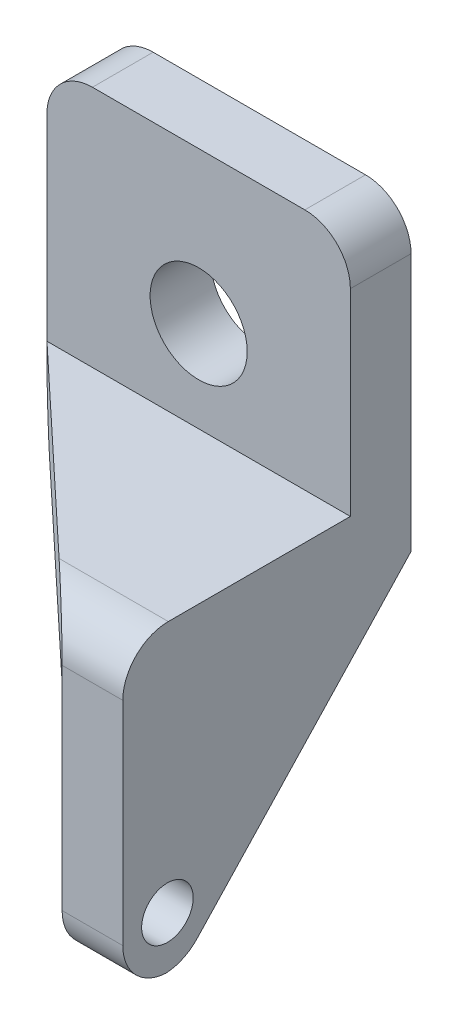
ISO-10303-21;
HEADER;
FILE_DESCRIPTION(('STEP AP214'),'2;1');
FILE_NAME('part.step','',(''),(''),'','','');
FILE_SCHEMA(('AUTOMOTIVE_DESIGN { 1 0 10303 214 1 1 1 1 }'));
ENDSEC;
DATA;
#1=APPLICATION_CONTEXT('core data for automotive mechanical design processes');
#2=APPLICATION_PROTOCOL_DEFINITION('international standard','automotive_design',2000,#1);
#3=PRODUCT_CONTEXT('',#1,'mechanical');
#4=PRODUCT('Part','Part','',(#3));
#5=PRODUCT_RELATED_PRODUCT_CATEGORY('part','',(#4));
#6=PRODUCT_DEFINITION_FORMATION('','',#4);
#7=PRODUCT_DEFINITION_CONTEXT('part definition',#1,'design');
#8=PRODUCT_DEFINITION('design','',#6,#7);
#9=PRODUCT_DEFINITION_SHAPE('','',#8);
#10=(LENGTH_UNIT() NAMED_UNIT(*) SI_UNIT(.MILLI.,.METRE.));
#11=(NAMED_UNIT(*) PLANE_ANGLE_UNIT() SI_UNIT($,.RADIAN.));
#12=(NAMED_UNIT(*) SI_UNIT($,.STERADIAN.) SOLID_ANGLE_UNIT());
#13=UNCERTAINTY_MEASURE_WITH_UNIT(LENGTH_MEASURE(1.E-05),#10,'distance_accuracy_value','');
#14=(GEOMETRIC_REPRESENTATION_CONTEXT(3) GLOBAL_UNCERTAINTY_ASSIGNED_CONTEXT((#13)) GLOBAL_UNIT_ASSIGNED_CONTEXT((#10,
#11,#12)) REPRESENTATION_CONTEXT('',''));
#15=CARTESIAN_POINT('',(0.,0.,0.));
#16=DIRECTION('',(0.,0.,1.));
#17=DIRECTION('',(1.,0.,0.));
#18=AXIS2_PLACEMENT_3D('',#15,#16,#17);
#19=CARTESIAN_POINT('',(0.,0.,4.));
#20=DIRECTION('',(0.,0.,-1.));
#21=DIRECTION('',(-1.,0.,0.));
#22=AXIS2_PLACEMENT_3D('',#19,#20,#21);
#23=PLANE('',#22);
#24=CARTESIAN_POINT('',(0.,0.,4.));
#25=DIRECTION('',(0.,0.,1.));
#26=DIRECTION('',(1.,0.,0.));
#27=AXIS2_PLACEMENT_3D('',#24,#25,#26);
#28=CIRCLE('',#27,3.2);
#29=CARTESIAN_POINT('',(3.2,0.,4.));
#30=VERTEX_POINT('',#29);
#31=EDGE_CURVE('E189',#30,#30,#28,.T.);
#32=ORIENTED_EDGE('',*,*,#31,.F.);
#33=EDGE_LOOP('',(#32));
#34=FACE_BOUND('',#33,.T.);
#35=DIRECTION('',(-1.,0.,0.));
#36=VECTOR('',#35,1.);
#37=CARTESIAN_POINT('',(-9.99999999999999,10.,4.));
#38=LINE('',#37,#36);
#39=CARTESIAN_POINT('',(7.,10.,4.));
#40=VERTEX_POINT('',#39);
#41=CARTESIAN_POINT('',(-7.,10.,4.));
#42=VERTEX_POINT('',#41);
#43=EDGE_CURVE('E195',#40,#42,#38,.T.);
#44=ORIENTED_EDGE('',*,*,#43,.T.);
#45=CARTESIAN_POINT('',(-7.,7.,4.));
#46=DIRECTION('',(0.,0.,-1.));
#47=DIRECTION('',(-1.,0.,0.));
#48=AXIS2_PLACEMENT_3D('',#45,#46,#47);
#49=CIRCLE('',#48,3.);
#50=CARTESIAN_POINT('',(-9.99999999999999,7.,4.));
#51=VERTEX_POINT('',#50);
#52=EDGE_CURVE('E11',#42,#51,#49,.F.);
#53=ORIENTED_EDGE('',*,*,#52,.T.);
#54=DIRECTION('',(0.,-1.,0.));
#55=VECTOR('',#54,1.);
#56=CARTESIAN_POINT('',(-10.,-10.,4.));
#57=LINE('',#56,#55);
#58=CARTESIAN_POINT('',(-10.,-6.,4.));
#59=VERTEX_POINT('',#58);
#60=EDGE_CURVE('E197',#51,#59,#57,.T.);
#61=ORIENTED_EDGE('',*,*,#60,.T.);
#62=DIRECTION('',(-1.,0.,0.));
#63=VECTOR('',#62,1.);
#64=CARTESIAN_POINT('',(-10.,-6.,4.));
#65=LINE('',#64,#63);
#66=CARTESIAN_POINT('',(10.,-6.,4.));
#67=VERTEX_POINT('',#66);
#68=EDGE_CURVE('E180',#67,#59,#65,.T.);
#69=ORIENTED_EDGE('',*,*,#68,.F.);
#70=DIRECTION('',(0.,1.,0.));
#71=VECTOR('',#70,1.);
#72=CARTESIAN_POINT('',(10.,-10.,4.));
#73=LINE('',#72,#71);
#74=CARTESIAN_POINT('',(10.,7.,4.));
#75=VERTEX_POINT('',#74);
#76=EDGE_CURVE('E143',#67,#75,#73,.T.);
#77=ORIENTED_EDGE('',*,*,#76,.T.);
#78=CARTESIAN_POINT('',(7.,7.,4.));
#79=DIRECTION('',(0.,0.,-1.));
#80=DIRECTION('',(-1.,0.,0.));
#81=AXIS2_PLACEMENT_3D('',#78,#79,#80);
#82=CIRCLE('',#81,3.);
#83=EDGE_CURVE('E41',#75,#40,#82,.F.);
#84=ORIENTED_EDGE('',*,*,#83,.T.);
#85=EDGE_LOOP('',(#44,#53,#61,#69,#77,#84));
#86=FACE_BOUND('',#85,.T.);
#87=ADVANCED_FACE('F33',(#34,#86),#23,.F.);
#88=CARTESIAN_POINT('',(0.,0.,0.));
#89=DIRECTION('',(0.,0.,-1.));
#90=DIRECTION('',(-1.,0.,0.));
#91=AXIS2_PLACEMENT_3D('',#88,#89,#90);
#92=PLANE('',#91);
#93=DIRECTION('',(1.,0.,0.));
#94=VECTOR('',#93,1.);
#95=CARTESIAN_POINT('',(-10.,-10.,0.));
#96=LINE('',#95,#94);
#97=CARTESIAN_POINT('',(-7.,-10.,0.));
#98=VERTEX_POINT('',#97);
#99=CARTESIAN_POINT('',(6.,-10.,0.));
#100=VERTEX_POINT('',#99);
#101=EDGE_CURVE('E132',#98,#100,#96,.T.);
#102=ORIENTED_EDGE('',*,*,#101,.F.);
#103=CARTESIAN_POINT('',(-7.,-7.,0.));
#104=DIRECTION('',(0.,0.,-1.));
#105=DIRECTION('',(-1.,0.,0.));
#106=AXIS2_PLACEMENT_3D('',#103,#104,#105);
#107=CIRCLE('',#106,3.);
#108=CARTESIAN_POINT('',(-10.,-7.,0.));
#109=VERTEX_POINT('',#108);
#110=EDGE_CURVE('E239',#98,#109,#107,.T.);
#111=ORIENTED_EDGE('',*,*,#110,.T.);
#112=DIRECTION('',(0.,-1.,0.));
#113=VECTOR('',#112,1.);
#114=CARTESIAN_POINT('',(-10.,-10.,0.));
#115=LINE('',#114,#113);
#116=CARTESIAN_POINT('',(-9.99999999999999,7.,0.));
#117=VERTEX_POINT('',#116);
#118=EDGE_CURVE('E144',#117,#109,#115,.T.);
#119=ORIENTED_EDGE('',*,*,#118,.F.);
#120=CARTESIAN_POINT('',(-7.,7.,0.));
#121=DIRECTION('',(0.,0.,-1.));
#122=DIRECTION('',(-1.,0.,0.));
#123=AXIS2_PLACEMENT_3D('',#120,#121,#122);
#124=CIRCLE('',#123,3.);
#125=CARTESIAN_POINT('',(-7.,10.,0.));
#126=VERTEX_POINT('',#125);
#127=EDGE_CURVE('E237',#117,#126,#124,.T.);
#128=ORIENTED_EDGE('',*,*,#127,.T.);
#129=DIRECTION('',(-1.,0.,0.));
#130=VECTOR('',#129,1.);
#131=CARTESIAN_POINT('',(-9.99999999999999,10.,0.));
#132=LINE('',#131,#130);
#133=CARTESIAN_POINT('',(7.,10.,0.));
#134=VERTEX_POINT('',#133);
#135=EDGE_CURVE('E201',#134,#126,#132,.T.);
#136=ORIENTED_EDGE('',*,*,#135,.F.);
#137=CARTESIAN_POINT('',(7.,7.,0.));
#138=DIRECTION('',(0.,0.,-1.));
#139=DIRECTION('',(-1.,0.,0.));
#140=AXIS2_PLACEMENT_3D('',#137,#138,#139);
#141=CIRCLE('',#140,3.);
#142=CARTESIAN_POINT('',(10.,7.,0.));
#143=VERTEX_POINT('',#142);
#144=EDGE_CURVE('E235',#134,#143,#141,.T.);
#145=ORIENTED_EDGE('',*,*,#144,.T.);
#146=DIRECTION('',(0.,1.,0.));
#147=VECTOR('',#146,1.);
#148=CARTESIAN_POINT('',(10.,-10.,0.));
#149=LINE('',#148,#147);
#150=CARTESIAN_POINT('',(10.,-10.,0.));
#151=VERTEX_POINT('',#150);
#152=EDGE_CURVE('E167',#151,#143,#149,.T.);
#153=ORIENTED_EDGE('',*,*,#152,.F.);
#154=DIRECTION('',(1.,0.,0.));
#155=VECTOR('',#154,1.);
#156=CARTESIAN_POINT('',(6.,-10.,0.));
#157=LINE('',#156,#155);
#158=EDGE_CURVE('E153',#100,#151,#157,.T.);
#159=ORIENTED_EDGE('',*,*,#158,.F.);
#160=EDGE_LOOP('',(#102,#111,#119,#128,#136,#145,#153,#159));
#161=FACE_BOUND('',#160,.T.);
#162=CARTESIAN_POINT('',(0.,0.,0.));
#163=DIRECTION('',(0.,0.,1.));
#164=DIRECTION('',(1.,0.,0.));
#165=AXIS2_PLACEMENT_3D('',#162,#163,#164);
#166=CIRCLE('',#165,3.2);
#167=CARTESIAN_POINT('',(3.2,0.,0.));
#168=VERTEX_POINT('',#167);
#169=EDGE_CURVE('E188',#168,#168,#166,.T.);
#170=ORIENTED_EDGE('',*,*,#169,.T.);
#171=EDGE_LOOP('',(#170));
#172=FACE_BOUND('',#171,.T.);
#173=ADVANCED_FACE('F164',(#161,#172),#92,.T.);
#174=CARTESIAN_POINT('',(10.,-10.,4.));
#175=DIRECTION('',(-1.,0.,0.));
#176=DIRECTION('',(0.,0.,1.));
#177=AXIS2_PLACEMENT_3D('',#174,#175,#176);
#178=PLANE('',#177);
#179=CARTESIAN_POINT('',(10.,-22.587455858698,16.0591175113538));
#180=DIRECTION('',(1.,0.,0.));
#181=DIRECTION('',(0.,0.,-1.));
#182=AXIS2_PLACEMENT_3D('',#179,#180,#181);
#183=CIRCLE('',#182,1.7);
#184=CARTESIAN_POINT('',(10.,-22.587455858698,14.3591175113538));
#185=VERTEX_POINT('',#184);
#186=EDGE_CURVE('E221',#185,#185,#183,.T.);
#187=ORIENTED_EDGE('',*,*,#186,.F.);
#188=EDGE_LOOP('',(#187));
#189=FACE_BOUND('',#188,.T.);
#190=DIRECTION('',(0.,0.,-1.));
#191=VECTOR('',#190,1.);
#192=CARTESIAN_POINT('',(10.,-6.,19.));
#193=LINE('',#192,#191);
#194=CARTESIAN_POINT('',(10.,-6.,16.));
#195=VERTEX_POINT('',#194);
#196=EDGE_CURVE('E184',#195,#67,#193,.T.);
#197=ORIENTED_EDGE('',*,*,#196,.F.);
#198=CARTESIAN_POINT('',(10.,-9.,16.));
#199=DIRECTION('',(-1.,0.,0.));
#200=DIRECTION('',(0.,0.,1.));
#201=AXIS2_PLACEMENT_3D('',#198,#199,#200);
#202=CIRCLE('',#201,3.);
#203=CARTESIAN_POINT('',(10.,-9.,19.));
#204=VERTEX_POINT('',#203);
#205=EDGE_CURVE('E232',#195,#204,#202,.F.);
#206=ORIENTED_EDGE('',*,*,#205,.T.);
#207=DIRECTION('',(0.,1.,0.));
#208=VECTOR('',#207,1.);
#209=CARTESIAN_POINT('',(10.,-10.,19.));
#210=LINE('',#209,#208);
#211=CARTESIAN_POINT('',(10.,-23.,19.));
#212=VERTEX_POINT('',#211);
#213=EDGE_CURVE('E181',#212,#204,#210,.T.);
#214=ORIENTED_EDGE('',*,*,#213,.F.);
#215=CARTESIAN_POINT('',(10.,-23.,16.));
#216=DIRECTION('',(-1.,0.,0.));
#217=DIRECTION('',(0.,0.,1.));
#218=AXIS2_PLACEMENT_3D('',#215,#216,#217);
#219=CIRCLE('',#218,3.);
#220=CARTESIAN_POINT('',(10.,-25.9962552580332,16.1498480186995));
#221=VERTEX_POINT('',#220);
#222=EDGE_CURVE('E206',#212,#221,#219,.F.);
#223=ORIENTED_EDGE('',*,*,#222,.T.);
#224=CARTESIAN_POINT('',(10.,-23.,16.299696037399));
#225=DIRECTION('',(-1.,0.,0.));
#226=DIRECTION('',(0.,0.,1.));
#227=AXIS2_PLACEMENT_3D('',#224,#225,#226);
#228=CIRCLE('',#227,3.);
#229=CARTESIAN_POINT('',(10.,-25.051823386644,14.1110844249787));
#230=VERTEX_POINT('',#229);
#231=EDGE_CURVE('E208',#221,#230,#228,.F.);
#232=ORIENTED_EDGE('',*,*,#231,.T.);
#233=DIRECTION('',(0.,0.729537204140085,-0.68394112888133));
#234=VECTOR('',#233,1.);
#235=CARTESIAN_POINT('',(10.,-10.,0.));
#236=LINE('',#235,#234);
#237=EDGE_CURVE('E174',#230,#151,#236,.T.);
#238=ORIENTED_EDGE('',*,*,#237,.T.);
#239=ORIENTED_EDGE('',*,*,#152,.T.);
#240=DIRECTION('',(0.,0.,-1.));
#241=VECTOR('',#240,1.);
#242=CARTESIAN_POINT('',(10.,7.,4.));
#243=LINE('',#242,#241);
#244=EDGE_CURVE('E230',#143,#75,#243,.F.);
#245=ORIENTED_EDGE('',*,*,#244,.T.);
#246=ORIENTED_EDGE('',*,*,#76,.F.);
#247=EDGE_LOOP('',(#197,#206,#214,#223,#232,#238,#239,#245,#246));
#248=FACE_BOUND('',#247,.T.);
#249=ADVANCED_FACE('F269',(#189,#248),#178,.F.);
#250=CARTESIAN_POINT('',(-9.99999999999999,10.,4.));
#251=DIRECTION('',(0.,-1.,0.));
#252=DIRECTION('',(0.,0.,-1.));
#253=AXIS2_PLACEMENT_3D('',#250,#251,#252);
#254=PLANE('',#253);
#255=ORIENTED_EDGE('',*,*,#135,.T.);
#256=DIRECTION('',(0.,0.,-1.));
#257=VECTOR('',#256,1.);
#258=CARTESIAN_POINT('',(-7.,10.,4.));
#259=LINE('',#258,#257);
#260=EDGE_CURVE('E48',#126,#42,#259,.F.);
#261=ORIENTED_EDGE('',*,*,#260,.T.);
#262=ORIENTED_EDGE('',*,*,#43,.F.);
#263=DIRECTION('',(0.,0.,-1.));
#264=VECTOR('',#263,1.);
#265=CARTESIAN_POINT('',(7.,10.,4.));
#266=LINE('',#265,#264);
#267=EDGE_CURVE('E246',#40,#134,#266,.T.);
#268=ORIENTED_EDGE('',*,*,#267,.T.);
#269=EDGE_LOOP('',(#255,#261,#262,#268));
#270=FACE_BOUND('',#269,.T.);
#271=ADVANCED_FACE('F251',(#270),#254,.F.);
#272=CARTESIAN_POINT('',(-10.,-10.,4.));
#273=DIRECTION('',(1.,0.,0.));
#274=DIRECTION('',(0.,1.,0.));
#275=AXIS2_PLACEMENT_3D('',#272,#273,#274);
#276=PLANE('',#275);
#277=ORIENTED_EDGE('',*,*,#118,.T.);
#278=DIRECTION('',(0.,0.,-1.));
#279=VECTOR('',#278,1.);
#280=CARTESIAN_POINT('',(-10.,-7.,4.));
#281=LINE('',#280,#279);
#282=CARTESIAN_POINT('',(-10.,-7.,4.));
#283=VERTEX_POINT('',#282);
#284=EDGE_CURVE('E244',#109,#283,#281,.F.);
#285=ORIENTED_EDGE('',*,*,#284,.T.);
#286=DIRECTION('',(0.,1.,0.));
#287=VECTOR('',#286,1.);
#288=CARTESIAN_POINT('',(-10.,-21.,4.));
#289=LINE('',#288,#287);
#290=EDGE_CURVE('E171',#283,#59,#289,.T.);
#291=ORIENTED_EDGE('',*,*,#290,.T.);
#292=ORIENTED_EDGE('',*,*,#60,.F.);
#293=DIRECTION('',(0.,0.,-1.));
#294=VECTOR('',#293,1.);
#295=CARTESIAN_POINT('',(-9.99999999999999,7.,4.));
#296=LINE('',#295,#294);
#297=EDGE_CURVE('E241',#51,#117,#296,.T.);
#298=ORIENTED_EDGE('',*,*,#297,.T.);
#299=EDGE_LOOP('',(#277,#285,#291,#292,#298));
#300=FACE_BOUND('',#299,.T.);
#301=ADVANCED_FACE('F260',(#300),#276,.F.);
#302=CARTESIAN_POINT('',(-10.,-10.,4.));
#303=DIRECTION('',(0.,1.,0.));
#304=DIRECTION('',(-1.,0.,0.));
#305=AXIS2_PLACEMENT_3D('',#302,#303,#304);
#306=PLANE('',#305);
#307=DIRECTION('',(-0.729537204140085,0.,-0.68394112888133));
#308=VECTOR('',#307,1.);
#309=CARTESIAN_POINT('',(-10.,-10.,4.));
#310=LINE('',#309,#308);
#311=CARTESIAN_POINT('',(6.00000000000001,-10.,19.));
#312=VERTEX_POINT('',#311);
#313=CARTESIAN_POINT('',(-7.,-10.,6.8125));
#314=VERTEX_POINT('',#313);
#315=EDGE_CURVE('E178',#312,#314,#310,.T.);
#316=ORIENTED_EDGE('',*,*,#315,.T.);
#317=DIRECTION('',(0.,0.,-1.));
#318=VECTOR('',#317,1.);
#319=CARTESIAN_POINT('',(-7.,-10.,4.));
#320=LINE('',#319,#318);
#321=EDGE_CURVE('E140',#314,#98,#320,.T.);
#322=ORIENTED_EDGE('',*,*,#321,.T.);
#323=ORIENTED_EDGE('',*,*,#101,.T.);
#324=DIRECTION('',(0.,0.,1.));
#325=VECTOR('',#324,1.);
#326=CARTESIAN_POINT('',(6.,-10.,19.));
#327=LINE('',#326,#325);
#328=EDGE_CURVE('E137',#100,#312,#327,.T.);
#329=ORIENTED_EDGE('',*,*,#328,.T.);
#330=EDGE_LOOP('',(#316,#322,#323,#329));
#331=FACE_BOUND('',#330,.T.);
#332=ADVANCED_FACE('F135',(#331),#306,.F.);
#333=CARTESIAN_POINT('',(0.,0.,4.));
#334=DIRECTION('',(0.,0.,-1.));
#335=DIRECTION('',(-1.,0.,0.));
#336=AXIS2_PLACEMENT_3D('',#333,#334,#335);
#337=CYLINDRICAL_SURFACE('',#336,3.2);
#338=ORIENTED_EDGE('',*,*,#31,.T.);
#339=EDGE_LOOP('',(#338));
#340=FACE_BOUND('',#339,.T.);
#341=ORIENTED_EDGE('',*,*,#169,.F.);
#342=EDGE_LOOP('',(#341));
#343=FACE_BOUND('',#342,.T.);
#344=ADVANCED_FACE('F286',(#340,#343),#337,.F.);
#345=CARTESIAN_POINT('',(-10.,-6.,19.));
#346=DIRECTION('',(0.,-1.,0.));
#347=DIRECTION('',(0.,0.,-1.));
#348=AXIS2_PLACEMENT_3D('',#345,#346,#347);
#349=PLANE('',#348);
#350=DIRECTION('',(-0.729537204140085,0.,-0.68394112888133));
#351=VECTOR('',#350,1.);
#352=CARTESIAN_POINT('',(-10.,-6.,4.));
#353=LINE('',#352,#351);
#354=CARTESIAN_POINT('',(2.80000000000001,-6.,16.));
#355=VERTEX_POINT('',#354);
#356=EDGE_CURVE('E168',#355,#59,#353,.T.);
#357=ORIENTED_EDGE('',*,*,#356,.F.);
#358=DIRECTION('',(-1.,0.,0.));
#359=VECTOR('',#358,1.);
#360=CARTESIAN_POINT('',(-10.,-6.,16.));
#361=LINE('',#360,#359);
#362=EDGE_CURVE('E228',#355,#195,#361,.F.);
#363=ORIENTED_EDGE('',*,*,#362,.T.);
#364=ORIENTED_EDGE('',*,*,#196,.T.);
#365=ORIENTED_EDGE('',*,*,#68,.T.);
#366=EDGE_LOOP('',(#357,#363,#364,#365));
#367=FACE_BOUND('',#366,.T.);
#368=ADVANCED_FACE('F320',(#367),#349,.F.);
#369=CARTESIAN_POINT('',(0.,0.,19.));
#370=DIRECTION('',(0.,0.,-1.));
#371=DIRECTION('',(-1.,0.,0.));
#372=AXIS2_PLACEMENT_3D('',#369,#370,#371);
#373=PLANE('',#372);
#374=ORIENTED_EDGE('',*,*,#213,.T.);
#375=DIRECTION('',(-1.,0.,0.));
#376=VECTOR('',#375,1.);
#377=CARTESIAN_POINT('',(0.,-9.,19.));
#378=LINE('',#377,#376);
#379=CARTESIAN_POINT('',(6.00000000000001,-9.,19.));
#380=VERTEX_POINT('',#379);
#381=EDGE_CURVE('E217',#204,#380,#378,.T.);
#382=ORIENTED_EDGE('',*,*,#381,.T.);
#383=DIRECTION('',(0.,-1.,0.));
#384=VECTOR('',#383,1.);
#385=CARTESIAN_POINT('',(6.00000000000001,0.,19.));
#386=LINE('',#385,#384);
#387=EDGE_CURVE('E199',#380,#312,#386,.T.);
#388=ORIENTED_EDGE('',*,*,#387,.T.);
#389=DIRECTION('',(0.,-1.,0.));
#390=VECTOR('',#389,1.);
#391=CARTESIAN_POINT('',(6.,-10.,19.));
#392=LINE('',#391,#390);
#393=CARTESIAN_POINT('',(6.,-23.,19.));
#394=VERTEX_POINT('',#393);
#395=EDGE_CURVE('E158',#312,#394,#392,.T.);
#396=ORIENTED_EDGE('',*,*,#395,.T.);
#397=DIRECTION('',(1.,0.,0.));
#398=VECTOR('',#397,1.);
#399=CARTESIAN_POINT('',(10.,-23.,19.));
#400=LINE('',#399,#398);
#401=EDGE_CURVE('E215',#394,#212,#400,.T.);
#402=ORIENTED_EDGE('',*,*,#401,.T.);
#403=EDGE_LOOP('',(#374,#382,#388,#396,#402));
#404=FACE_BOUND('',#403,.T.);
#405=ADVANCED_FACE('F325',(#404),#373,.F.);
#406=CARTESIAN_POINT('',(-10.,-21.,4.));
#407=DIRECTION('',(0.68394112888133,0.,-0.729537204140085));
#408=DIRECTION('',(-0.729537204140085,0.,-0.68394112888133));
#409=AXIS2_PLACEMENT_3D('',#406,#407,#408);
#410=PLANE('',#409);
#411=ORIENTED_EDGE('',*,*,#387,.F.);
#412=CARTESIAN_POINT('',(2.80000000000001,-9.,16.));
#413=DIRECTION('',(0.68394112888133,0.,-0.729537204140085));
#414=DIRECTION('',(-0.729537204140085,0.,-0.68394112888133));
#415=AXIS2_PLACEMENT_3D('',#412,#413,#414);
#416=ELLIPSE('',#415,4.38634243989226,3.);
#417=EDGE_CURVE('E226',#380,#355,#416,.F.);
#418=ORIENTED_EDGE('',*,*,#417,.T.);
#419=ORIENTED_EDGE('',*,*,#356,.T.);
#420=ORIENTED_EDGE('',*,*,#290,.F.);
#421=CARTESIAN_POINT('',(-7.,-7.,6.8125));
#422=DIRECTION('',(0.68394112888133,0.,-0.729537204140085));
#423=DIRECTION('',(-0.729537204140085,0.,-0.68394112888133));
#424=AXIS2_PLACEMENT_3D('',#421,#422,#423);
#425=ELLIPSE('',#424,4.11219603739899,3.);
#426=EDGE_CURVE('E224',#283,#314,#425,.F.);
#427=ORIENTED_EDGE('',*,*,#426,.T.);
#428=ORIENTED_EDGE('',*,*,#315,.F.);
#429=EDGE_LOOP('',(#411,#418,#419,#420,#427,#428));
#430=FACE_BOUND('',#429,.T.);
#431=ADVANCED_FACE('F318',(#430),#410,.F.);
#432=CARTESIAN_POINT('',(6.,-10.,0.));
#433=DIRECTION('',(0.,-0.68394112888133,-0.729537204140085));
#434=DIRECTION('',(0.,0.729537204140085,-0.68394112888133));
#435=AXIS2_PLACEMENT_3D('',#432,#433,#434);
#436=PLANE('',#435);
#437=ORIENTED_EDGE('',*,*,#237,.F.);
#438=DIRECTION('',(1.,0.,0.));
#439=VECTOR('',#438,1.);
#440=CARTESIAN_POINT('',(6.,-25.051823386644,14.1110844249787));
#441=LINE('',#440,#439);
#442=CARTESIAN_POINT('',(6.,-25.051823386644,14.1110844249787));
#443=VERTEX_POINT('',#442);
#444=EDGE_CURVE('E156',#230,#443,#441,.F.);
#445=ORIENTED_EDGE('',*,*,#444,.T.);
#446=DIRECTION('',(0.,0.729537204140085,-0.68394112888133));
#447=VECTOR('',#446,1.);
#448=CARTESIAN_POINT('',(6.,-10.,0.));
#449=LINE('',#448,#447);
#450=EDGE_CURVE('E150',#443,#100,#449,.T.);
#451=ORIENTED_EDGE('',*,*,#450,.T.);
#452=ORIENTED_EDGE('',*,*,#158,.T.);
#453=EDGE_LOOP('',(#437,#445,#451,#452));
#454=FACE_BOUND('',#453,.T.);
#455=ADVANCED_FACE('F152',(#454),#436,.T.);
#456=CARTESIAN_POINT('',(6.,0.,0.));
#457=DIRECTION('',(1.,0.,0.));
#458=DIRECTION('',(0.,0.,-1.));
#459=AXIS2_PLACEMENT_3D('',#456,#457,#458);
#460=PLANE('',#459);
#461=CARTESIAN_POINT('',(6.,-22.587455858698,16.0591175113538));
#462=DIRECTION('',(1.,0.,0.));
#463=DIRECTION('',(0.,0.,-1.));
#464=AXIS2_PLACEMENT_3D('',#461,#462,#463);
#465=CIRCLE('',#464,1.7);
#466=CARTESIAN_POINT('',(6.,-22.587455858698,14.3591175113538));
#467=VERTEX_POINT('',#466);
#468=EDGE_CURVE('E330',#467,#467,#465,.T.);
#469=ORIENTED_EDGE('',*,*,#468,.T.);
#470=EDGE_LOOP('',(#469));
#471=FACE_BOUND('',#470,.T.);
#472=ORIENTED_EDGE('',*,*,#450,.F.);
#473=CARTESIAN_POINT('',(6.,-23.,16.299696037399));
#474=DIRECTION('',(1.,0.,0.));
#475=DIRECTION('',(0.,0.,-1.));
#476=AXIS2_PLACEMENT_3D('',#473,#474,#475);
#477=CIRCLE('',#476,3.);
#478=CARTESIAN_POINT('',(6.,-25.9962552580332,16.1498480186995));
#479=VERTEX_POINT('',#478);
#480=EDGE_CURVE('E213',#443,#479,#477,.F.);
#481=ORIENTED_EDGE('',*,*,#480,.T.);
#482=CARTESIAN_POINT('',(6.,-23.,16.));
#483=DIRECTION('',(1.,0.,0.));
#484=DIRECTION('',(0.,0.,-1.));
#485=AXIS2_PLACEMENT_3D('',#482,#483,#484);
#486=CIRCLE('',#485,3.);
#487=EDGE_CURVE('E211',#479,#394,#486,.F.);
#488=ORIENTED_EDGE('',*,*,#487,.T.);
#489=ORIENTED_EDGE('',*,*,#395,.F.);
#490=ORIENTED_EDGE('',*,*,#328,.F.);
#491=EDGE_LOOP('',(#472,#481,#488,#489,#490));
#492=FACE_BOUND('',#491,.T.);
#493=ADVANCED_FACE('F161',(#471,#492),#460,.F.);
#494=CARTESIAN_POINT('',(6.,-22.587455858698,16.0591175113538));
#495=DIRECTION('',(1.,0.,0.));
#496=DIRECTION('',(0.,0.,-1.));
#497=AXIS2_PLACEMENT_3D('',#494,#495,#496);
#498=CYLINDRICAL_SURFACE('',#497,1.7);
#499=ORIENTED_EDGE('',*,*,#468,.F.);
#500=EDGE_LOOP('',(#499));
#501=FACE_BOUND('',#500,.T.);
#502=ORIENTED_EDGE('',*,*,#186,.T.);
#503=EDGE_LOOP('',(#502));
#504=FACE_BOUND('',#503,.T.);
#505=ADVANCED_FACE('F306',(#501,#504),#498,.F.);
#506=CARTESIAN_POINT('',(0.,-23.,16.));
#507=DIRECTION('',(-1.,0.,0.));
#508=DIRECTION('',(0.,0.,1.));
#509=AXIS2_PLACEMENT_3D('',#506,#507,#508);
#510=CYLINDRICAL_SURFACE('',#509,3.);
#511=ORIENTED_EDGE('',*,*,#401,.F.);
#512=ORIENTED_EDGE('',*,*,#487,.F.);
#513=DIRECTION('',(-1.,0.,0.));
#514=VECTOR('',#513,1.);
#515=CARTESIAN_POINT('',(8.,-25.9962552580332,16.1498480186995));
#516=LINE('',#515,#514);
#517=EDGE_CURVE('E218',#221,#479,#516,.T.);
#518=ORIENTED_EDGE('',*,*,#517,.F.);
#519=ORIENTED_EDGE('',*,*,#222,.F.);
#520=EDGE_LOOP('',(#511,#512,#518,#519));
#521=FACE_BOUND('',#520,.T.);
#522=ADVANCED_FACE('F302',(#521),#510,.T.);
#523=CARTESIAN_POINT('',(6.,-23.,16.299696037399));
#524=DIRECTION('',(1.,0.,0.));
#525=DIRECTION('',(0.,0.,-1.));
#526=AXIS2_PLACEMENT_3D('',#523,#524,#525);
#527=CYLINDRICAL_SURFACE('',#526,3.);
#528=ORIENTED_EDGE('',*,*,#480,.F.);
#529=ORIENTED_EDGE('',*,*,#444,.F.);
#530=ORIENTED_EDGE('',*,*,#231,.F.);
#531=ORIENTED_EDGE('',*,*,#517,.T.);
#532=EDGE_LOOP('',(#528,#529,#530,#531));
#533=FACE_BOUND('',#532,.T.);
#534=ADVANCED_FACE('F298',(#533),#527,.T.);
#535=CARTESIAN_POINT('',(0.,-9.,16.));
#536=DIRECTION('',(-1.,0.,0.));
#537=DIRECTION('',(0.,0.,1.));
#538=AXIS2_PLACEMENT_3D('',#535,#536,#537);
#539=CYLINDRICAL_SURFACE('',#538,3.);
#540=ORIENTED_EDGE('',*,*,#205,.F.);
#541=ORIENTED_EDGE('',*,*,#362,.F.);
#542=ORIENTED_EDGE('',*,*,#417,.F.);
#543=ORIENTED_EDGE('',*,*,#381,.F.);
#544=EDGE_LOOP('',(#540,#541,#542,#543));
#545=FACE_BOUND('',#544,.T.);
#546=ADVANCED_FACE('F301',(#545),#539,.T.);
#547=CARTESIAN_POINT('',(-7.,-7.,4.));
#548=DIRECTION('',(0.,0.,-1.));
#549=DIRECTION('',(-1.,0.,0.));
#550=AXIS2_PLACEMENT_3D('',#547,#548,#549);
#551=CYLINDRICAL_SURFACE('',#550,3.);
#552=ORIENTED_EDGE('',*,*,#426,.F.);
#553=ORIENTED_EDGE('',*,*,#284,.F.);
#554=ORIENTED_EDGE('',*,*,#110,.F.);
#555=ORIENTED_EDGE('',*,*,#321,.F.);
#556=EDGE_LOOP('',(#552,#553,#554,#555));
#557=FACE_BOUND('',#556,.T.);
#558=ADVANCED_FACE('F276',(#557),#551,.T.);
#559=CARTESIAN_POINT('',(-7.,7.,4.));
#560=DIRECTION('',(0.,0.,-1.));
#561=DIRECTION('',(-1.,0.,0.));
#562=AXIS2_PLACEMENT_3D('',#559,#560,#561);
#563=CYLINDRICAL_SURFACE('',#562,3.);
#564=ORIENTED_EDGE('',*,*,#52,.F.);
#565=ORIENTED_EDGE('',*,*,#260,.F.);
#566=ORIENTED_EDGE('',*,*,#127,.F.);
#567=ORIENTED_EDGE('',*,*,#297,.F.);
#568=EDGE_LOOP('',(#564,#565,#566,#567));
#569=FACE_BOUND('',#568,.T.);
#570=ADVANCED_FACE('F257',(#569),#563,.T.);
#571=CARTESIAN_POINT('',(7.,7.,4.));
#572=DIRECTION('',(0.,0.,-1.));
#573=DIRECTION('',(-1.,0.,0.));
#574=AXIS2_PLACEMENT_3D('',#571,#572,#573);
#575=CYLINDRICAL_SURFACE('',#574,3.);
#576=ORIENTED_EDGE('',*,*,#83,.F.);
#577=ORIENTED_EDGE('',*,*,#244,.F.);
#578=ORIENTED_EDGE('',*,*,#144,.F.);
#579=ORIENTED_EDGE('',*,*,#267,.F.);
#580=EDGE_LOOP('',(#576,#577,#578,#579));
#581=FACE_BOUND('',#580,.T.);
#582=ADVANCED_FACE('F35',(#581),#575,.T.);
#583=CLOSED_SHELL('',(#87,#173,#249,#271,#301,#332,#344,#368,#405,#431,#455,#493,#505,#522,#534,
#546,#558,#570,#582));
#584=MANIFOLD_SOLID_BREP('B2',#583);
#585=ADVANCED_BREP_SHAPE_REPRESENTATION('',(#18,#584),#14);
#586=SHAPE_DEFINITION_REPRESENTATION(#9,#585);
ENDSEC;
END-ISO-10303-21;
